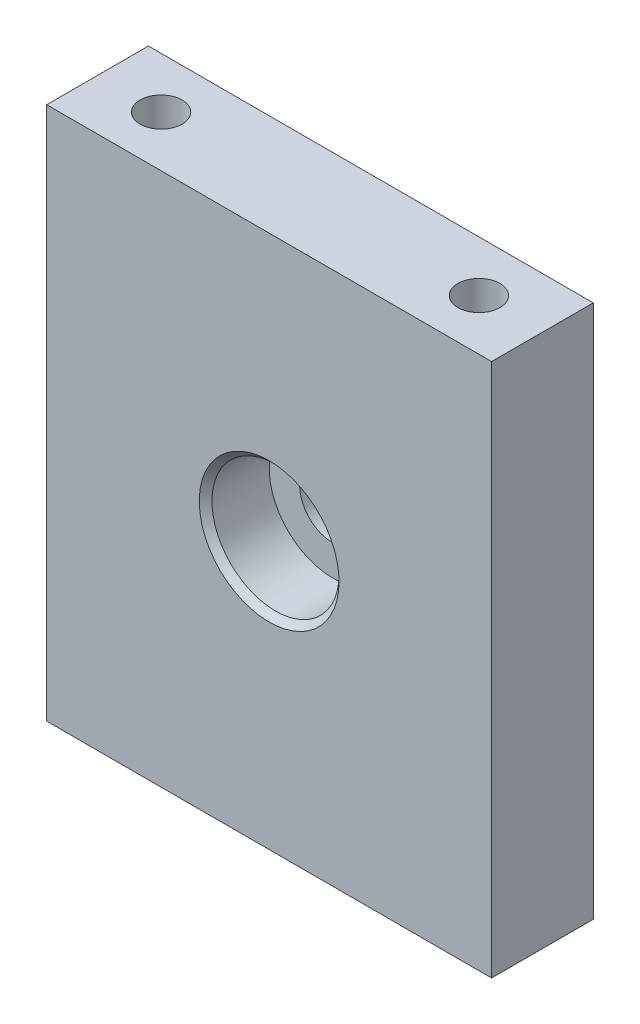
ISO-10303-21;
HEADER;
FILE_DESCRIPTION(('STEP AP214'),'2;1');
FILE_NAME('part.step','',(''),(''),'','','');
FILE_SCHEMA(('AUTOMOTIVE_DESIGN { 1 0 10303 214 1 1 1 1 }'));
ENDSEC;
DATA;
#1=APPLICATION_CONTEXT('core data for automotive mechanical design processes');
#2=APPLICATION_PROTOCOL_DEFINITION('international standard','automotive_design',2000,#1);
#3=PRODUCT_CONTEXT('',#1,'mechanical');
#4=PRODUCT('Part','Part','',(#3));
#5=PRODUCT_RELATED_PRODUCT_CATEGORY('part','',(#4));
#6=PRODUCT_DEFINITION_FORMATION('','',#4);
#7=PRODUCT_DEFINITION_CONTEXT('part definition',#1,'design');
#8=PRODUCT_DEFINITION('design','',#6,#7);
#9=PRODUCT_DEFINITION_SHAPE('','',#8);
#10=(LENGTH_UNIT() NAMED_UNIT(*) SI_UNIT(.MILLI.,.METRE.));
#11=(NAMED_UNIT(*) PLANE_ANGLE_UNIT() SI_UNIT($,.RADIAN.));
#12=(NAMED_UNIT(*) SI_UNIT($,.STERADIAN.) SOLID_ANGLE_UNIT());
#13=UNCERTAINTY_MEASURE_WITH_UNIT(LENGTH_MEASURE(1.E-05),#10,'distance_accuracy_value','');
#14=(GEOMETRIC_REPRESENTATION_CONTEXT(3) GLOBAL_UNCERTAINTY_ASSIGNED_CONTEXT((#13)) GLOBAL_UNIT_ASSIGNED_CONTEXT((#10,
#11,#12)) REPRESENTATION_CONTEXT('',''));
#15=CARTESIAN_POINT('',(0.,0.,0.));
#16=DIRECTION('',(0.,0.,1.));
#17=DIRECTION('',(1.,0.,0.));
#18=AXIS2_PLACEMENT_3D('',#15,#16,#17);
#19=CARTESIAN_POINT('',(0.,0.,-7.5));
#20=DIRECTION('',(0.,0.,1.));
#21=DIRECTION('',(1.,0.,0.));
#22=AXIS2_PLACEMENT_3D('',#19,#20,#21);
#23=CYLINDRICAL_SURFACE('',#22,2.6);
#24=CARTESIAN_POINT('',(0.,0.,-2.));
#25=DIRECTION('',(0.,0.,-1.));
#26=DIRECTION('',(-1.,0.,0.));
#27=AXIS2_PLACEMENT_3D('',#24,#25,#26);
#28=CIRCLE('',#27,2.6);
#29=CARTESIAN_POINT('',(-2.6,0.,-2.));
#30=VERTEX_POINT('',#29);
#31=EDGE_CURVE('E183',#30,#30,#28,.T.);
#32=ORIENTED_EDGE('',*,*,#31,.T.);
#33=EDGE_LOOP('',(#32));
#34=FACE_BOUND('',#33,.T.);
#35=CARTESIAN_POINT('',(0.,0.,-1.));
#36=DIRECTION('',(0.,0.,1.));
#37=DIRECTION('',(1.,0.,0.));
#38=AXIS2_PLACEMENT_3D('',#35,#36,#37);
#39=CIRCLE('',#38,2.6);
#40=CARTESIAN_POINT('',(2.6,0.,-1.));
#41=VERTEX_POINT('',#40);
#42=EDGE_CURVE('E186',#41,#41,#39,.F.);
#43=ORIENTED_EDGE('',*,*,#42,.F.);
#44=EDGE_LOOP('',(#43));
#45=FACE_BOUND('',#44,.T.);
#46=ADVANCED_FACE('F42',(#34,#45),#23,.F.);
#47=CARTESIAN_POINT('',(0.,0.,-4.));
#48=DIRECTION('',(0.,0.,1.));
#49=DIRECTION('',(1.,0.,0.));
#50=AXIS2_PLACEMENT_3D('',#47,#48,#49);
#51=PLANE('',#50);
#52=CARTESIAN_POINT('',(0.,0.,-4.));
#53=DIRECTION('',(0.,0.,1.));
#54=DIRECTION('',(1.,0.,0.));
#55=AXIS2_PLACEMENT_3D('',#52,#53,#54);
#56=CIRCLE('',#55,11.);
#57=CARTESIAN_POINT('',(11.,0.,-4.));
#58=VERTEX_POINT('',#57);
#59=EDGE_CURVE('E11',#58,#58,#56,.T.);
#60=ORIENTED_EDGE('',*,*,#59,.T.);
#61=EDGE_LOOP('',(#60));
#62=FACE_BOUND('',#61,.T.);
#63=DIRECTION('',(0.,1.,0.));
#64=VECTOR('',#63,1.);
#65=CARTESIAN_POINT('',(17.5,21.,-4.));
#66=LINE('',#65,#64);
#67=CARTESIAN_POINT('',(17.5,-21.,-4.));
#68=VERTEX_POINT('',#67);
#69=CARTESIAN_POINT('',(17.5,21.,-4.));
#70=VERTEX_POINT('',#69);
#71=EDGE_CURVE('E220',#68,#70,#66,.T.);
#72=ORIENTED_EDGE('',*,*,#71,.F.);
#73=DIRECTION('',(1.,0.,0.));
#74=VECTOR('',#73,1.);
#75=CARTESIAN_POINT('',(-17.5,-21.,-4.));
#76=LINE('',#75,#74);
#77=CARTESIAN_POINT('',(-17.5,-21.,-4.));
#78=VERTEX_POINT('',#77);
#79=EDGE_CURVE('E225',#78,#68,#76,.T.);
#80=ORIENTED_EDGE('',*,*,#79,.F.);
#81=DIRECTION('',(0.,-1.,0.));
#82=VECTOR('',#81,1.);
#83=CARTESIAN_POINT('',(-17.5,21.,-4.));
#84=LINE('',#83,#82);
#85=CARTESIAN_POINT('',(-17.5,21.,-4.));
#86=VERTEX_POINT('',#85);
#87=EDGE_CURVE('E236',#86,#78,#84,.T.);
#88=ORIENTED_EDGE('',*,*,#87,.F.);
#89=DIRECTION('',(-1.,0.,0.));
#90=VECTOR('',#89,1.);
#91=CARTESIAN_POINT('',(-17.5,21.,-4.));
#92=LINE('',#91,#90);
#93=EDGE_CURVE('E234',#70,#86,#92,.T.);
#94=ORIENTED_EDGE('',*,*,#93,.F.);
#95=EDGE_LOOP('',(#72,#80,#88,#94));
#96=FACE_BOUND('',#95,.T.);
#97=ADVANCED_FACE('F332',(#62,#96),#51,.F.);
#98=CARTESIAN_POINT('',(17.5,21.,4.));
#99=DIRECTION('',(-1.,0.,0.));
#100=DIRECTION('',(0.,-1.,0.));
#101=AXIS2_PLACEMENT_3D('',#98,#99,#100);
#102=PLANE('',#101);
#103=ORIENTED_EDGE('',*,*,#71,.T.);
#104=DIRECTION('',(0.,0.,-1.));
#105=VECTOR('',#104,1.);
#106=CARTESIAN_POINT('',(17.5,21.,4.));
#107=LINE('',#106,#105);
#108=CARTESIAN_POINT('',(17.5,21.,4.));
#109=VERTEX_POINT('',#108);
#110=EDGE_CURVE('E247',#109,#70,#107,.T.);
#111=ORIENTED_EDGE('',*,*,#110,.F.);
#112=DIRECTION('',(0.,1.,0.));
#113=VECTOR('',#112,1.);
#114=CARTESIAN_POINT('',(17.5,21.,4.));
#115=LINE('',#114,#113);
#116=CARTESIAN_POINT('',(17.5,-21.,4.));
#117=VERTEX_POINT('',#116);
#118=EDGE_CURVE('E221',#117,#109,#115,.T.);
#119=ORIENTED_EDGE('',*,*,#118,.F.);
#120=DIRECTION('',(0.,0.,-1.));
#121=VECTOR('',#120,1.);
#122=CARTESIAN_POINT('',(17.5,-21.,4.));
#123=LINE('',#122,#121);
#124=EDGE_CURVE('E231',#117,#68,#123,.T.);
#125=ORIENTED_EDGE('',*,*,#124,.T.);
#126=EDGE_LOOP('',(#103,#111,#119,#125));
#127=FACE_BOUND('',#126,.T.);
#128=ADVANCED_FACE('F338',(#127),#102,.F.);
#129=CARTESIAN_POINT('',(-17.5,21.,4.));
#130=DIRECTION('',(0.,-1.,0.));
#131=DIRECTION('',(0.,0.,-1.));
#132=AXIS2_PLACEMENT_3D('',#129,#130,#131);
#133=PLANE('',#132);
#134=CARTESIAN_POINT('',(-12.5,21.,0.));
#135=DIRECTION('',(0.,1.,0.));
#136=DIRECTION('',(0.,0.,1.));
#137=AXIS2_PLACEMENT_3D('',#134,#135,#136);
#138=CIRCLE('',#137,1.64999999999999);
#139=CARTESIAN_POINT('',(-12.5,21.,1.64999999999999));
#140=VERTEX_POINT('',#139);
#141=EDGE_CURVE('E517',#140,#140,#138,.T.);
#142=ORIENTED_EDGE('',*,*,#141,.F.);
#143=EDGE_LOOP('',(#142));
#144=FACE_BOUND('',#143,.T.);
#145=CARTESIAN_POINT('',(12.5,21.,0.));
#146=DIRECTION('',(0.,1.,0.));
#147=DIRECTION('',(0.,0.,1.));
#148=AXIS2_PLACEMENT_3D('',#145,#146,#147);
#149=CIRCLE('',#148,1.64999999999999);
#150=CARTESIAN_POINT('',(12.5,21.,1.64999999999998));
#151=VERTEX_POINT('',#150);
#152=EDGE_CURVE('E519',#151,#151,#149,.T.);
#153=ORIENTED_EDGE('',*,*,#152,.F.);
#154=EDGE_LOOP('',(#153));
#155=FACE_BOUND('',#154,.T.);
#156=ORIENTED_EDGE('',*,*,#93,.T.);
#157=DIRECTION('',(0.,0.,-1.));
#158=VECTOR('',#157,1.);
#159=CARTESIAN_POINT('',(-17.5,21.,4.));
#160=LINE('',#159,#158);
#161=CARTESIAN_POINT('',(-17.5,21.,4.));
#162=VERTEX_POINT('',#161);
#163=EDGE_CURVE('E244',#162,#86,#160,.T.);
#164=ORIENTED_EDGE('',*,*,#163,.F.);
#165=DIRECTION('',(-1.,0.,0.));
#166=VECTOR('',#165,1.);
#167=CARTESIAN_POINT('',(-17.5,21.,4.));
#168=LINE('',#167,#166);
#169=EDGE_CURVE('E224',#109,#162,#168,.T.);
#170=ORIENTED_EDGE('',*,*,#169,.F.);
#171=ORIENTED_EDGE('',*,*,#110,.T.);
#172=EDGE_LOOP('',(#156,#164,#170,#171));
#173=FACE_BOUND('',#172,.T.);
#174=ADVANCED_FACE('F393',(#144,#155,#173),#133,.F.);
#175=CARTESIAN_POINT('',(-17.5,21.,4.));
#176=DIRECTION('',(1.,0.,0.));
#177=DIRECTION('',(0.,1.,0.));
#178=AXIS2_PLACEMENT_3D('',#175,#176,#177);
#179=PLANE('',#178);
#180=ORIENTED_EDGE('',*,*,#87,.T.);
#181=DIRECTION('',(0.,0.,-1.));
#182=VECTOR('',#181,1.);
#183=CARTESIAN_POINT('',(-17.5,-21.,4.));
#184=LINE('',#183,#182);
#185=CARTESIAN_POINT('',(-17.5,-21.,4.));
#186=VERTEX_POINT('',#185);
#187=EDGE_CURVE('E241',#186,#78,#184,.T.);
#188=ORIENTED_EDGE('',*,*,#187,.F.);
#189=DIRECTION('',(0.,-1.,0.));
#190=VECTOR('',#189,1.);
#191=CARTESIAN_POINT('',(-17.5,21.,4.));
#192=LINE('',#191,#190);
#193=EDGE_CURVE('E227',#162,#186,#192,.T.);
#194=ORIENTED_EDGE('',*,*,#193,.F.);
#195=ORIENTED_EDGE('',*,*,#163,.T.);
#196=EDGE_LOOP('',(#180,#188,#194,#195));
#197=FACE_BOUND('',#196,.T.);
#198=ADVANCED_FACE('F389',(#197),#179,.F.);
#199=CARTESIAN_POINT('',(-17.5,-21.,4.));
#200=DIRECTION('',(0.,1.,0.));
#201=DIRECTION('',(0.,0.,1.));
#202=AXIS2_PLACEMENT_3D('',#199,#200,#201);
#203=PLANE('',#202);
#204=CARTESIAN_POINT('',(-12.5,-21.,0.));
#205=DIRECTION('',(0.,1.,0.));
#206=DIRECTION('',(0.,0.,1.));
#207=AXIS2_PLACEMENT_3D('',#204,#205,#206);
#208=CIRCLE('',#207,1.64999999999999);
#209=CARTESIAN_POINT('',(-12.5,-21.,1.64999999999999));
#210=VERTEX_POINT('',#209);
#211=EDGE_CURVE('E514',#210,#210,#208,.T.);
#212=ORIENTED_EDGE('',*,*,#211,.T.);
#213=EDGE_LOOP('',(#212));
#214=FACE_BOUND('',#213,.T.);
#215=CARTESIAN_POINT('',(12.5,-21.,0.));
#216=DIRECTION('',(0.,1.,0.));
#217=DIRECTION('',(0.,0.,1.));
#218=AXIS2_PLACEMENT_3D('',#215,#216,#217);
#219=CIRCLE('',#218,1.64999999999999);
#220=CARTESIAN_POINT('',(12.5,-21.,1.64999999999999));
#221=VERTEX_POINT('',#220);
#222=EDGE_CURVE('E287',#221,#221,#219,.T.);
#223=ORIENTED_EDGE('',*,*,#222,.T.);
#224=EDGE_LOOP('',(#223));
#225=FACE_BOUND('',#224,.T.);
#226=ORIENTED_EDGE('',*,*,#79,.T.);
#227=ORIENTED_EDGE('',*,*,#124,.F.);
#228=DIRECTION('',(1.,0.,0.));
#229=VECTOR('',#228,1.);
#230=CARTESIAN_POINT('',(-17.5,-21.,4.));
#231=LINE('',#230,#229);
#232=EDGE_CURVE('E229',#186,#117,#231,.T.);
#233=ORIENTED_EDGE('',*,*,#232,.F.);
#234=ORIENTED_EDGE('',*,*,#187,.T.);
#235=EDGE_LOOP('',(#226,#227,#233,#234));
#236=FACE_BOUND('',#235,.T.);
#237=ADVANCED_FACE('F384',(#214,#225,#236),#203,.F.);
#238=CARTESIAN_POINT('',(0.,0.,4.));
#239=DIRECTION('',(0.,0.,1.));
#240=DIRECTION('',(1.,0.,0.));
#241=AXIS2_PLACEMENT_3D('',#238,#239,#240);
#242=PLANE('',#241);
#243=CARTESIAN_POINT('',(0.,0.,4.));
#244=DIRECTION('',(0.,0.,1.));
#245=DIRECTION('',(1.,0.,0.));
#246=AXIS2_PLACEMENT_3D('',#243,#244,#245);
#247=CIRCLE('',#246,5.50000000000001);
#248=CARTESIAN_POINT('',(5.50000000000001,0.,4.));
#249=VERTEX_POINT('',#248);
#250=EDGE_CURVE('E309',#249,#249,#247,.F.);
#251=ORIENTED_EDGE('',*,*,#250,.T.);
#252=EDGE_LOOP('',(#251));
#253=FACE_BOUND('',#252,.T.);
#254=ORIENTED_EDGE('',*,*,#118,.T.);
#255=ORIENTED_EDGE('',*,*,#169,.T.);
#256=ORIENTED_EDGE('',*,*,#193,.T.);
#257=ORIENTED_EDGE('',*,*,#232,.T.);
#258=EDGE_LOOP('',(#254,#255,#256,#257));
#259=FACE_BOUND('',#258,.T.);
#260=ADVANCED_FACE('F379',(#253,#259),#242,.T.);
#261=CARTESIAN_POINT('',(0.,0.,-7.5));
#262=DIRECTION('',(0.,0.,-1.));
#263=DIRECTION('',(-1.,0.,0.));
#264=AXIS2_PLACEMENT_3D('',#261,#262,#263);
#265=PLANE('',#264);
#266=CARTESIAN_POINT('',(5.,5.,-7.5));
#267=DIRECTION('',(0.,0.,-1.));
#268=DIRECTION('',(-1.,0.,0.));
#269=AXIS2_PLACEMENT_3D('',#266,#267,#268);
#270=CIRCLE('',#269,1.5);
#271=CARTESIAN_POINT('',(6.5,4.99999999999999,-7.5));
#272=VERTEX_POINT('',#271);
#273=CARTESIAN_POINT('',(4.99999999999999,6.5,-7.5));
#274=VERTEX_POINT('',#273);
#275=EDGE_CURVE('E267',#272,#274,#270,.F.);
#276=ORIENTED_EDGE('',*,*,#275,.T.);
#277=DIRECTION('',(-1.,0.,0.));
#278=VECTOR('',#277,1.);
#279=CARTESIAN_POINT('',(0.,6.5,-7.5));
#280=LINE('',#279,#278);
#281=CARTESIAN_POINT('',(-4.99999999999999,6.5,-7.5));
#282=VERTEX_POINT('',#281);
#283=EDGE_CURVE('E269',#274,#282,#280,.T.);
#284=ORIENTED_EDGE('',*,*,#283,.T.);
#285=CARTESIAN_POINT('',(-5.,5.,-7.5));
#286=DIRECTION('',(0.,0.,-1.));
#287=DIRECTION('',(-1.,0.,0.));
#288=AXIS2_PLACEMENT_3D('',#285,#286,#287);
#289=CIRCLE('',#288,1.5);
#290=CARTESIAN_POINT('',(-6.5,4.99999999999999,-7.5));
#291=VERTEX_POINT('',#290);
#292=EDGE_CURVE('E265',#282,#291,#289,.F.);
#293=ORIENTED_EDGE('',*,*,#292,.T.);
#294=DIRECTION('',(0.,-1.,0.));
#295=VECTOR('',#294,1.);
#296=CARTESIAN_POINT('',(-6.5,0.,-7.5));
#297=LINE('',#296,#295);
#298=CARTESIAN_POINT('',(-6.5,-5.,-7.5));
#299=VERTEX_POINT('',#298);
#300=EDGE_CURVE('E261',#291,#299,#297,.T.);
#301=ORIENTED_EDGE('',*,*,#300,.T.);
#302=CARTESIAN_POINT('',(-5.,-5.,-7.5));
#303=DIRECTION('',(0.,0.,-1.));
#304=DIRECTION('',(-1.,0.,0.));
#305=AXIS2_PLACEMENT_3D('',#302,#303,#304);
#306=CIRCLE('',#305,1.5);
#307=CARTESIAN_POINT('',(-4.99999999999999,-6.5,-7.5));
#308=VERTEX_POINT('',#307);
#309=EDGE_CURVE('E257',#299,#308,#306,.F.);
#310=ORIENTED_EDGE('',*,*,#309,.T.);
#311=DIRECTION('',(1.,0.,0.));
#312=VECTOR('',#311,1.);
#313=CARTESIAN_POINT('',(0.,-6.5,-7.5));
#314=LINE('',#313,#312);
#315=CARTESIAN_POINT('',(4.99999999999999,-6.5,-7.5));
#316=VERTEX_POINT('',#315);
#317=EDGE_CURVE('E255',#308,#316,#314,.T.);
#318=ORIENTED_EDGE('',*,*,#317,.T.);
#319=CARTESIAN_POINT('',(5.,-5.,-7.5));
#320=DIRECTION('',(0.,0.,-1.));
#321=DIRECTION('',(-1.,0.,0.));
#322=AXIS2_PLACEMENT_3D('',#319,#320,#321);
#323=CIRCLE('',#322,1.5);
#324=CARTESIAN_POINT('',(6.5,-4.99999999999999,-7.5));
#325=VERTEX_POINT('',#324);
#326=EDGE_CURVE('E259',#316,#325,#323,.F.);
#327=ORIENTED_EDGE('',*,*,#326,.T.);
#328=DIRECTION('',(0.,1.,0.));
#329=VECTOR('',#328,1.);
#330=CARTESIAN_POINT('',(6.5,0.,-7.5));
#331=LINE('',#330,#329);
#332=EDGE_CURVE('E263',#325,#272,#331,.T.);
#333=ORIENTED_EDGE('',*,*,#332,.T.);
#334=EDGE_LOOP('',(#276,#284,#293,#301,#310,#318,#327,#333));
#335=FACE_BOUND('',#334,.T.);
#336=CARTESIAN_POINT('',(0.,0.,-7.5));
#337=DIRECTION('',(0.,0.,-1.));
#338=DIRECTION('',(-1.,0.,0.));
#339=AXIS2_PLACEMENT_3D('',#336,#337,#338);
#340=CIRCLE('',#339,10.);
#341=CARTESIAN_POINT('',(-10.,0.,-7.5));
#342=VERTEX_POINT('',#341);
#343=EDGE_CURVE('E217',#342,#342,#340,.T.);
#344=ORIENTED_EDGE('',*,*,#343,.T.);
#345=EDGE_LOOP('',(#344));
#346=FACE_BOUND('',#345,.T.);
#347=ADVANCED_FACE('F376',(#335,#346),#265,.T.);
#348=CARTESIAN_POINT('',(0.,0.,-7.5));
#349=DIRECTION('',(0.,0.,1.));
#350=DIRECTION('',(1.,0.,0.));
#351=AXIS2_PLACEMENT_3D('',#348,#349,#350);
#352=CYLINDRICAL_SURFACE('',#351,10.);
#353=CARTESIAN_POINT('',(0.,0.,-5.));
#354=DIRECTION('',(0.,0.,1.));
#355=DIRECTION('',(1.,0.,0.));
#356=AXIS2_PLACEMENT_3D('',#353,#354,#355);
#357=CIRCLE('',#356,10.);
#358=CARTESIAN_POINT('',(10.,0.,-5.));
#359=VERTEX_POINT('',#358);
#360=EDGE_CURVE('E51',#359,#359,#357,.F.);
#361=ORIENTED_EDGE('',*,*,#360,.T.);
#362=EDGE_LOOP('',(#361));
#363=FACE_BOUND('',#362,.T.);
#364=ORIENTED_EDGE('',*,*,#343,.F.);
#365=EDGE_LOOP('',(#364));
#366=FACE_BOUND('',#365,.T.);
#367=ADVANCED_FACE('F314',(#363,#366),#352,.T.);
#368=CARTESIAN_POINT('',(-5.,5.,-7.5));
#369=DIRECTION('',(0.,0.,1.));
#370=DIRECTION('',(1.,0.,0.));
#371=AXIS2_PLACEMENT_3D('',#368,#369,#370);
#372=CYLINDRICAL_SURFACE('',#371,1.);
#373=DIRECTION('',(0.,0.,1.));
#374=VECTOR('',#373,1.);
#375=CARTESIAN_POINT('',(-6.,4.99999999999999,-7.5));
#376=LINE('',#375,#374);
#377=CARTESIAN_POINT('',(-6.,4.99999999999999,-7.));
#378=VERTEX_POINT('',#377);
#379=CARTESIAN_POINT('',(-6.,4.99999999999999,-2.));
#380=VERTEX_POINT('',#379);
#381=EDGE_CURVE('E168',#378,#380,#376,.T.);
#382=ORIENTED_EDGE('',*,*,#381,.F.);
#383=CARTESIAN_POINT('',(-5.,5.,-7.));
#384=DIRECTION('',(0.,0.,-1.));
#385=DIRECTION('',(-1.,0.,0.));
#386=AXIS2_PLACEMENT_3D('',#383,#384,#385);
#387=CIRCLE('',#386,1.);
#388=CARTESIAN_POINT('',(-4.99999999999999,6.,-7.));
#389=VERTEX_POINT('',#388);
#390=EDGE_CURVE('E274',#378,#389,#387,.T.);
#391=ORIENTED_EDGE('',*,*,#390,.T.);
#392=DIRECTION('',(0.,0.,1.));
#393=VECTOR('',#392,1.);
#394=CARTESIAN_POINT('',(-4.99999999999999,6.,-7.5));
#395=LINE('',#394,#393);
#396=CARTESIAN_POINT('',(-4.99999999999999,6.,-2.));
#397=VERTEX_POINT('',#396);
#398=EDGE_CURVE('E215',#389,#397,#395,.T.);
#399=ORIENTED_EDGE('',*,*,#398,.T.);
#400=CARTESIAN_POINT('',(-5.,5.,-2.));
#401=DIRECTION('',(0.,0.,-1.));
#402=DIRECTION('',(-1.,0.,0.));
#403=AXIS2_PLACEMENT_3D('',#400,#401,#402);
#404=CIRCLE('',#403,1.);
#405=EDGE_CURVE('E177',#380,#397,#404,.T.);
#406=ORIENTED_EDGE('',*,*,#405,.F.);
#407=EDGE_LOOP('',(#382,#391,#399,#406));
#408=FACE_BOUND('',#407,.T.);
#409=ADVANCED_FACE('F371',(#408),#372,.F.);
#410=CARTESIAN_POINT('',(4.99999999999999,6.,-7.5));
#411=DIRECTION('',(0.,-1.,0.));
#412=DIRECTION('',(0.,0.,-1.));
#413=AXIS2_PLACEMENT_3D('',#410,#411,#412);
#414=PLANE('',#413);
#415=ORIENTED_EDGE('',*,*,#398,.F.);
#416=DIRECTION('',(1.,0.,0.));
#417=VECTOR('',#416,1.);
#418=CARTESIAN_POINT('',(4.99999999999999,6.,-7.));
#419=LINE('',#418,#417);
#420=CARTESIAN_POINT('',(4.99999999999999,6.,-7.));
#421=VERTEX_POINT('',#420);
#422=EDGE_CURVE('E249',#389,#421,#419,.T.);
#423=ORIENTED_EDGE('',*,*,#422,.T.);
#424=DIRECTION('',(0.,0.,1.));
#425=VECTOR('',#424,1.);
#426=CARTESIAN_POINT('',(4.99999999999999,6.,-7.5));
#427=LINE('',#426,#425);
#428=CARTESIAN_POINT('',(4.99999999999999,6.,-2.));
#429=VERTEX_POINT('',#428);
#430=EDGE_CURVE('E213',#421,#429,#427,.T.);
#431=ORIENTED_EDGE('',*,*,#430,.T.);
#432=DIRECTION('',(1.,0.,0.));
#433=VECTOR('',#432,1.);
#434=CARTESIAN_POINT('',(-4.99999999999999,6.,-2.));
#435=LINE('',#434,#433);
#436=EDGE_CURVE('E193',#397,#429,#435,.T.);
#437=ORIENTED_EDGE('',*,*,#436,.F.);
#438=EDGE_LOOP('',(#415,#423,#431,#437));
#439=FACE_BOUND('',#438,.T.);
#440=ADVANCED_FACE('F367',(#439),#414,.T.);
#441=CARTESIAN_POINT('',(5.,5.,-7.5));
#442=DIRECTION('',(0.,0.,1.));
#443=DIRECTION('',(1.,0.,0.));
#444=AXIS2_PLACEMENT_3D('',#441,#442,#443);
#445=CYLINDRICAL_SURFACE('',#444,1.);
#446=ORIENTED_EDGE('',*,*,#430,.F.);
#447=CARTESIAN_POINT('',(5.,5.,-7.));
#448=DIRECTION('',(0.,0.,-1.));
#449=DIRECTION('',(-1.,0.,0.));
#450=AXIS2_PLACEMENT_3D('',#447,#448,#449);
#451=CIRCLE('',#450,1.);
#452=CARTESIAN_POINT('',(6.,4.99999999999999,-7.));
#453=VERTEX_POINT('',#452);
#454=EDGE_CURVE('E272',#421,#453,#451,.T.);
#455=ORIENTED_EDGE('',*,*,#454,.T.);
#456=DIRECTION('',(0.,0.,1.));
#457=VECTOR('',#456,1.);
#458=CARTESIAN_POINT('',(6.,4.99999999999999,-7.5));
#459=LINE('',#458,#457);
#460=CARTESIAN_POINT('',(6.,4.99999999999999,-2.));
#461=VERTEX_POINT('',#460);
#462=EDGE_CURVE('E211',#453,#461,#459,.T.);
#463=ORIENTED_EDGE('',*,*,#462,.T.);
#464=CARTESIAN_POINT('',(5.,5.,-2.));
#465=DIRECTION('',(0.,0.,-1.));
#466=DIRECTION('',(-1.,0.,0.));
#467=AXIS2_PLACEMENT_3D('',#464,#465,#466);
#468=CIRCLE('',#467,1.);
#469=EDGE_CURVE('E196',#429,#461,#468,.T.);
#470=ORIENTED_EDGE('',*,*,#469,.F.);
#471=EDGE_LOOP('',(#446,#455,#463,#470));
#472=FACE_BOUND('',#471,.T.);
#473=ADVANCED_FACE('F363',(#472),#445,.F.);
#474=CARTESIAN_POINT('',(6.,4.99999999999999,-7.5));
#475=DIRECTION('',(-1.,0.,0.));
#476=DIRECTION('',(0.,-1.,0.));
#477=AXIS2_PLACEMENT_3D('',#474,#475,#476);
#478=PLANE('',#477);
#479=ORIENTED_EDGE('',*,*,#462,.F.);
#480=DIRECTION('',(0.,-1.,0.));
#481=VECTOR('',#480,1.);
#482=CARTESIAN_POINT('',(6.,4.99999999999999,-7.));
#483=LINE('',#482,#481);
#484=CARTESIAN_POINT('',(6.,-4.99999999999999,-7.));
#485=VERTEX_POINT('',#484);
#486=EDGE_CURVE('E276',#453,#485,#483,.T.);
#487=ORIENTED_EDGE('',*,*,#486,.T.);
#488=DIRECTION('',(0.,0.,1.));
#489=VECTOR('',#488,1.);
#490=CARTESIAN_POINT('',(6.,-4.99999999999999,-7.5));
#491=LINE('',#490,#489);
#492=CARTESIAN_POINT('',(6.,-4.99999999999999,-2.));
#493=VERTEX_POINT('',#492);
#494=EDGE_CURVE('E209',#485,#493,#491,.T.);
#495=ORIENTED_EDGE('',*,*,#494,.T.);
#496=DIRECTION('',(0.,-1.,0.));
#497=VECTOR('',#496,1.);
#498=CARTESIAN_POINT('',(6.,4.99999999999999,-2.));
#499=LINE('',#498,#497);
#500=EDGE_CURVE('E199',#461,#493,#499,.T.);
#501=ORIENTED_EDGE('',*,*,#500,.F.);
#502=EDGE_LOOP('',(#479,#487,#495,#501));
#503=FACE_BOUND('',#502,.T.);
#504=ADVANCED_FACE('F360',(#503),#478,.T.);
#505=CARTESIAN_POINT('',(5.,-5.,-7.5));
#506=DIRECTION('',(0.,0.,1.));
#507=DIRECTION('',(1.,0.,0.));
#508=AXIS2_PLACEMENT_3D('',#505,#506,#507);
#509=CYLINDRICAL_SURFACE('',#508,1.);
#510=ORIENTED_EDGE('',*,*,#494,.F.);
#511=CARTESIAN_POINT('',(5.,-5.,-7.));
#512=DIRECTION('',(0.,0.,-1.));
#513=DIRECTION('',(-1.,0.,0.));
#514=AXIS2_PLACEMENT_3D('',#511,#512,#513);
#515=CIRCLE('',#514,1.);
#516=CARTESIAN_POINT('',(4.99999999999999,-6.,-7.));
#517=VERTEX_POINT('',#516);
#518=EDGE_CURVE('E66',#485,#517,#515,.T.);
#519=ORIENTED_EDGE('',*,*,#518,.T.);
#520=DIRECTION('',(0.,0.,1.));
#521=VECTOR('',#520,1.);
#522=CARTESIAN_POINT('',(4.99999999999999,-6.,-7.5));
#523=LINE('',#522,#521);
#524=CARTESIAN_POINT('',(4.99999999999999,-6.,-2.));
#525=VERTEX_POINT('',#524);
#526=EDGE_CURVE('E207',#517,#525,#523,.T.);
#527=ORIENTED_EDGE('',*,*,#526,.T.);
#528=CARTESIAN_POINT('',(5.,-5.,-2.));
#529=DIRECTION('',(0.,0.,-1.));
#530=DIRECTION('',(-1.,0.,0.));
#531=AXIS2_PLACEMENT_3D('',#528,#529,#530);
#532=CIRCLE('',#531,1.);
#533=EDGE_CURVE('E202',#493,#525,#532,.T.);
#534=ORIENTED_EDGE('',*,*,#533,.F.);
#535=EDGE_LOOP('',(#510,#519,#527,#534));
#536=FACE_BOUND('',#535,.T.);
#537=ADVANCED_FACE('F357',(#536),#509,.F.);
#538=CARTESIAN_POINT('',(4.99999999999999,-6.,-7.5));
#539=DIRECTION('',(0.,1.,0.));
#540=DIRECTION('',(0.,0.,1.));
#541=AXIS2_PLACEMENT_3D('',#538,#539,#540);
#542=PLANE('',#541);
#543=ORIENTED_EDGE('',*,*,#526,.F.);
#544=DIRECTION('',(-1.,0.,0.));
#545=VECTOR('',#544,1.);
#546=CARTESIAN_POINT('',(4.99999999999999,-6.,-7.));
#547=LINE('',#546,#545);
#548=CARTESIAN_POINT('',(-4.99999999999999,-6.,-7.));
#549=VERTEX_POINT('',#548);
#550=EDGE_CURVE('E58',#517,#549,#547,.T.);
#551=ORIENTED_EDGE('',*,*,#550,.T.);
#552=DIRECTION('',(0.,0.,1.));
#553=VECTOR('',#552,1.);
#554=CARTESIAN_POINT('',(-4.99999999999999,-6.,-7.5));
#555=LINE('',#554,#553);
#556=CARTESIAN_POINT('',(-4.99999999999999,-6.,-2.));
#557=VERTEX_POINT('',#556);
#558=EDGE_CURVE('E167',#549,#557,#555,.T.);
#559=ORIENTED_EDGE('',*,*,#558,.T.);
#560=DIRECTION('',(-1.,0.,0.));
#561=VECTOR('',#560,1.);
#562=CARTESIAN_POINT('',(4.99999999999999,-6.,-2.));
#563=LINE('',#562,#561);
#564=EDGE_CURVE('E182',#525,#557,#563,.T.);
#565=ORIENTED_EDGE('',*,*,#564,.F.);
#566=EDGE_LOOP('',(#543,#551,#559,#565));
#567=FACE_BOUND('',#566,.T.);
#568=ADVANCED_FACE('F354',(#567),#542,.T.);
#569=CARTESIAN_POINT('',(-5.,-5.,-7.5));
#570=DIRECTION('',(0.,0.,1.));
#571=DIRECTION('',(1.,0.,0.));
#572=AXIS2_PLACEMENT_3D('',#569,#570,#571);
#573=CYLINDRICAL_SURFACE('',#572,1.);
#574=ORIENTED_EDGE('',*,*,#558,.F.);
#575=CARTESIAN_POINT('',(-5.,-5.,-7.));
#576=DIRECTION('',(0.,0.,-1.));
#577=DIRECTION('',(-1.,0.,0.));
#578=AXIS2_PLACEMENT_3D('',#575,#576,#577);
#579=CIRCLE('',#578,1.);
#580=CARTESIAN_POINT('',(-6.,-5.,-7.));
#581=VERTEX_POINT('',#580);
#582=EDGE_CURVE('E164',#549,#581,#579,.T.);
#583=ORIENTED_EDGE('',*,*,#582,.T.);
#584=DIRECTION('',(0.,0.,1.));
#585=VECTOR('',#584,1.);
#586=CARTESIAN_POINT('',(-6.,-5.,-7.5));
#587=LINE('',#586,#585);
#588=CARTESIAN_POINT('',(-6.,-5.,-2.));
#589=VERTEX_POINT('',#588);
#590=EDGE_CURVE('E157',#581,#589,#587,.T.);
#591=ORIENTED_EDGE('',*,*,#590,.T.);
#592=CARTESIAN_POINT('',(-5.,-5.,-2.));
#593=DIRECTION('',(0.,0.,-1.));
#594=DIRECTION('',(-1.,0.,0.));
#595=AXIS2_PLACEMENT_3D('',#592,#593,#594);
#596=CIRCLE('',#595,1.);
#597=EDGE_CURVE('E161',#557,#589,#596,.T.);
#598=ORIENTED_EDGE('',*,*,#597,.F.);
#599=EDGE_LOOP('',(#574,#583,#591,#598));
#600=FACE_BOUND('',#599,.T.);
#601=ADVANCED_FACE('F159',(#600),#573,.F.);
#602=CARTESIAN_POINT('',(-6.,4.99999999999999,-7.5));
#603=DIRECTION('',(1.,0.,0.));
#604=DIRECTION('',(0.,1.,0.));
#605=AXIS2_PLACEMENT_3D('',#602,#603,#604);
#606=PLANE('',#605);
#607=ORIENTED_EDGE('',*,*,#590,.F.);
#608=DIRECTION('',(0.,1.,0.));
#609=VECTOR('',#608,1.);
#610=CARTESIAN_POINT('',(-6.,4.99999999999999,-7.));
#611=LINE('',#610,#609);
#612=EDGE_CURVE('E278',#581,#378,#611,.T.);
#613=ORIENTED_EDGE('',*,*,#612,.T.);
#614=ORIENTED_EDGE('',*,*,#381,.T.);
#615=DIRECTION('',(0.,1.,0.));
#616=VECTOR('',#615,1.);
#617=CARTESIAN_POINT('',(-6.,-5.,-2.));
#618=LINE('',#617,#616);
#619=EDGE_CURVE('E171',#589,#380,#618,.T.);
#620=ORIENTED_EDGE('',*,*,#619,.F.);
#621=EDGE_LOOP('',(#607,#613,#614,#620));
#622=FACE_BOUND('',#621,.T.);
#623=ADVANCED_FACE('F172',(#622),#606,.T.);
#624=CARTESIAN_POINT('',(-5.,-5.,-2.));
#625=DIRECTION('',(0.,0.,-1.));
#626=DIRECTION('',(-1.,0.,0.));
#627=AXIS2_PLACEMENT_3D('',#624,#625,#626);
#628=PLANE('',#627);
#629=ORIENTED_EDGE('',*,*,#31,.F.);
#630=EDGE_LOOP('',(#629));
#631=FACE_BOUND('',#630,.T.);
#632=ORIENTED_EDGE('',*,*,#597,.T.);
#633=ORIENTED_EDGE('',*,*,#619,.T.);
#634=ORIENTED_EDGE('',*,*,#405,.T.);
#635=ORIENTED_EDGE('',*,*,#436,.T.);
#636=ORIENTED_EDGE('',*,*,#469,.T.);
#637=ORIENTED_EDGE('',*,*,#500,.T.);
#638=ORIENTED_EDGE('',*,*,#533,.T.);
#639=ORIENTED_EDGE('',*,*,#564,.T.);
#640=EDGE_LOOP('',(#632,#633,#634,#635,#636,#637,#638,#639));
#641=FACE_BOUND('',#640,.T.);
#642=ADVANCED_FACE('F179',(#631,#641),#628,.T.);
#643=CARTESIAN_POINT('',(0.,0.,-1.));
#644=DIRECTION('',(0.,0.,1.));
#645=DIRECTION('',(1.,0.,0.));
#646=AXIS2_PLACEMENT_3D('',#643,#644,#645);
#647=PLANE('',#646);
#648=CARTESIAN_POINT('',(0.,0.,-1.));
#649=DIRECTION('',(0.,0.,1.));
#650=DIRECTION('',(1.,0.,0.));
#651=AXIS2_PLACEMENT_3D('',#648,#649,#650);
#652=CIRCLE('',#651,5.);
#653=CARTESIAN_POINT('',(5.,0.,-1.));
#654=VERTEX_POINT('',#653);
#655=EDGE_CURVE('E189',#654,#654,#652,.T.);
#656=ORIENTED_EDGE('',*,*,#655,.T.);
#657=EDGE_LOOP('',(#656));
#658=FACE_BOUND('',#657,.T.);
#659=ORIENTED_EDGE('',*,*,#42,.T.);
#660=EDGE_LOOP('',(#659));
#661=FACE_BOUND('',#660,.T.);
#662=ADVANCED_FACE('F348',(#658,#661),#647,.T.);
#663=CARTESIAN_POINT('',(0.,0.,-1.));
#664=DIRECTION('',(0.,0.,1.));
#665=DIRECTION('',(1.,0.,0.));
#666=AXIS2_PLACEMENT_3D('',#663,#664,#665);
#667=CYLINDRICAL_SURFACE('',#666,5.);
#668=CARTESIAN_POINT('',(0.,0.,3.49999999999999));
#669=DIRECTION('',(0.,0.,1.));
#670=DIRECTION('',(1.,0.,0.));
#671=AXIS2_PLACEMENT_3D('',#668,#669,#670);
#672=CIRCLE('',#671,5.);
#673=CARTESIAN_POINT('',(5.,0.,3.49999999999999));
#674=VERTEX_POINT('',#673);
#675=EDGE_CURVE('E283',#674,#674,#672,.T.);
#676=ORIENTED_EDGE('',*,*,#675,.T.);
#677=EDGE_LOOP('',(#676));
#678=FACE_BOUND('',#677,.T.);
#679=ORIENTED_EDGE('',*,*,#655,.F.);
#680=EDGE_LOOP('',(#679));
#681=FACE_BOUND('',#680,.T.);
#682=ADVANCED_FACE('F344',(#678,#681),#667,.F.);
#683=CARTESIAN_POINT('',(4.99999999999999,-6.,-7.));
#684=DIRECTION('',(0.,-0.707106781186547,0.707106781186547));
#685=DIRECTION('',(-1.,0.,0.));
#686=AXIS2_PLACEMENT_3D('',#683,#684,#685);
#687=PLANE('',#686);
#688=DIRECTION('',(0.,0.707106781186547,0.707106781186547));
#689=VECTOR('',#688,1.);
#690=CARTESIAN_POINT('',(4.99999999999999,-6.5,-7.5));
#691=LINE('',#690,#689);
#692=EDGE_CURVE('E301',#316,#517,#691,.T.);
#693=ORIENTED_EDGE('',*,*,#692,.F.);
#694=ORIENTED_EDGE('',*,*,#317,.F.);
#695=DIRECTION('',(0.,-0.707106781186547,-0.707106781186547));
#696=VECTOR('',#695,1.);
#697=CARTESIAN_POINT('',(-4.99999999999999,-6.,-7.));
#698=LINE('',#697,#696);
#699=EDGE_CURVE('E304',#549,#308,#698,.T.);
#700=ORIENTED_EDGE('',*,*,#699,.F.);
#701=ORIENTED_EDGE('',*,*,#550,.F.);
#702=EDGE_LOOP('',(#693,#694,#700,#701));
#703=FACE_BOUND('',#702,.T.);
#704=ADVANCED_FACE('F450',(#703),#687,.F.);
#705=CARTESIAN_POINT('',(-5.,-5.,-7.));
#706=DIRECTION('',(0.,0.,-1.));
#707=DIRECTION('',(-1.,0.,0.));
#708=AXIS2_PLACEMENT_3D('',#705,#706,#707);
#709=CONICAL_SURFACE('',#708,1.,0.785398163397448);
#710=ORIENTED_EDGE('',*,*,#699,.T.);
#711=ORIENTED_EDGE('',*,*,#309,.F.);
#712=DIRECTION('',(-0.707106781186547,0.,-0.707106781186547));
#713=VECTOR('',#712,1.);
#714=CARTESIAN_POINT('',(-6.,-5.,-7.));
#715=LINE('',#714,#713);
#716=EDGE_CURVE('E298',#581,#299,#715,.T.);
#717=ORIENTED_EDGE('',*,*,#716,.F.);
#718=ORIENTED_EDGE('',*,*,#582,.F.);
#719=EDGE_LOOP('',(#710,#711,#717,#718));
#720=FACE_BOUND('',#719,.T.);
#721=ADVANCED_FACE('F443',(#720),#709,.F.);
#722=CARTESIAN_POINT('',(5.,-5.,-7.));
#723=DIRECTION('',(0.,0.,-1.));
#724=DIRECTION('',(-1.,0.,0.));
#725=AXIS2_PLACEMENT_3D('',#722,#723,#724);
#726=CONICAL_SURFACE('',#725,1.,0.785398163397448);
#727=ORIENTED_EDGE('',*,*,#692,.T.);
#728=ORIENTED_EDGE('',*,*,#518,.F.);
#729=DIRECTION('',(-0.707106781186547,0.,0.707106781186547));
#730=VECTOR('',#729,1.);
#731=CARTESIAN_POINT('',(6.5,-4.99999999999999,-7.5));
#732=LINE('',#731,#730);
#733=EDGE_CURVE('E295',#325,#485,#732,.T.);
#734=ORIENTED_EDGE('',*,*,#733,.F.);
#735=ORIENTED_EDGE('',*,*,#326,.F.);
#736=EDGE_LOOP('',(#727,#728,#734,#735));
#737=FACE_BOUND('',#736,.T.);
#738=ADVANCED_FACE('F436',(#737),#726,.F.);
#739=CARTESIAN_POINT('',(-6.,4.99999999999999,-7.));
#740=DIRECTION('',(-0.707106781186547,0.,0.707106781186547));
#741=DIRECTION('',(0.,1.,0.));
#742=AXIS2_PLACEMENT_3D('',#739,#740,#741);
#743=PLANE('',#742);
#744=ORIENTED_EDGE('',*,*,#716,.T.);
#745=ORIENTED_EDGE('',*,*,#300,.F.);
#746=DIRECTION('',(-0.707106781186547,0.,-0.707106781186547));
#747=VECTOR('',#746,1.);
#748=CARTESIAN_POINT('',(-6.,4.99999999999999,-7.));
#749=LINE('',#748,#747);
#750=EDGE_CURVE('E292',#378,#291,#749,.T.);
#751=ORIENTED_EDGE('',*,*,#750,.F.);
#752=ORIENTED_EDGE('',*,*,#612,.F.);
#753=EDGE_LOOP('',(#744,#745,#751,#752));
#754=FACE_BOUND('',#753,.T.);
#755=ADVANCED_FACE('F429',(#754),#743,.F.);
#756=CARTESIAN_POINT('',(6.,4.99999999999999,-7.));
#757=DIRECTION('',(0.707106781186547,0.,0.707106781186547));
#758=DIRECTION('',(0.,-1.,0.));
#759=AXIS2_PLACEMENT_3D('',#756,#757,#758);
#760=PLANE('',#759);
#761=ORIENTED_EDGE('',*,*,#733,.T.);
#762=ORIENTED_EDGE('',*,*,#486,.F.);
#763=DIRECTION('',(-0.707106781186547,0.,0.707106781186547));
#764=VECTOR('',#763,1.);
#765=CARTESIAN_POINT('',(6.5,4.99999999999999,-7.5));
#766=LINE('',#765,#764);
#767=EDGE_CURVE('E289',#272,#453,#766,.T.);
#768=ORIENTED_EDGE('',*,*,#767,.F.);
#769=ORIENTED_EDGE('',*,*,#332,.F.);
#770=EDGE_LOOP('',(#761,#762,#768,#769));
#771=FACE_BOUND('',#770,.T.);
#772=ADVANCED_FACE('F422',(#771),#760,.F.);
#773=CARTESIAN_POINT('',(-5.,5.,-7.));
#774=DIRECTION('',(0.,0.,-1.));
#775=DIRECTION('',(-1.,0.,0.));
#776=AXIS2_PLACEMENT_3D('',#773,#774,#775);
#777=CONICAL_SURFACE('',#776,1.,0.785398163397448);
#778=ORIENTED_EDGE('',*,*,#750,.T.);
#779=ORIENTED_EDGE('',*,*,#292,.F.);
#780=DIRECTION('',(0.,0.707106781186547,-0.707106781186547));
#781=VECTOR('',#780,1.);
#782=CARTESIAN_POINT('',(-4.99999999999999,6.,-7.));
#783=LINE('',#782,#781);
#784=EDGE_CURVE('E286',#389,#282,#783,.T.);
#785=ORIENTED_EDGE('',*,*,#784,.F.);
#786=ORIENTED_EDGE('',*,*,#390,.F.);
#787=EDGE_LOOP('',(#778,#779,#785,#786));
#788=FACE_BOUND('',#787,.T.);
#789=ADVANCED_FACE('F415',(#788),#777,.F.);
#790=CARTESIAN_POINT('',(5.,5.,-7.));
#791=DIRECTION('',(0.,0.,-1.));
#792=DIRECTION('',(-1.,0.,0.));
#793=AXIS2_PLACEMENT_3D('',#790,#791,#792);
#794=CONICAL_SURFACE('',#793,1.,0.785398163397448);
#795=ORIENTED_EDGE('',*,*,#767,.T.);
#796=ORIENTED_EDGE('',*,*,#454,.F.);
#797=DIRECTION('',(0.,-0.707106781186547,0.707106781186547));
#798=VECTOR('',#797,1.);
#799=CARTESIAN_POINT('',(4.99999999999999,6.5,-7.5));
#800=LINE('',#799,#798);
#801=EDGE_CURVE('E284',#274,#421,#800,.T.);
#802=ORIENTED_EDGE('',*,*,#801,.F.);
#803=ORIENTED_EDGE('',*,*,#275,.F.);
#804=EDGE_LOOP('',(#795,#796,#802,#803));
#805=FACE_BOUND('',#804,.T.);
#806=ADVANCED_FACE('F408',(#805),#794,.F.);
#807=CARTESIAN_POINT('',(4.99999999999999,6.,-7.));
#808=DIRECTION('',(0.,0.707106781186547,0.707106781186547));
#809=DIRECTION('',(1.,0.,0.));
#810=AXIS2_PLACEMENT_3D('',#807,#808,#809);
#811=PLANE('',#810);
#812=ORIENTED_EDGE('',*,*,#784,.T.);
#813=ORIENTED_EDGE('',*,*,#283,.F.);
#814=ORIENTED_EDGE('',*,*,#801,.T.);
#815=ORIENTED_EDGE('',*,*,#422,.F.);
#816=EDGE_LOOP('',(#812,#813,#814,#815));
#817=FACE_BOUND('',#816,.T.);
#818=ADVANCED_FACE('F328',(#817),#811,.F.);
#819=CARTESIAN_POINT('',(0.,0.,3.49999999999999));
#820=DIRECTION('',(0.,0.,1.));
#821=DIRECTION('',(1.,0.,0.));
#822=AXIS2_PLACEMENT_3D('',#819,#820,#821);
#823=CONICAL_SURFACE('',#822,5.,0.785398163397445);
#824=ORIENTED_EDGE('',*,*,#250,.F.);
#825=EDGE_LOOP('',(#824));
#826=FACE_BOUND('',#825,.T.);
#827=ORIENTED_EDGE('',*,*,#675,.F.);
#828=EDGE_LOOP('',(#827));
#829=FACE_BOUND('',#828,.T.);
#830=ADVANCED_FACE('F319',(#826,#829),#823,.F.);
#831=CARTESIAN_POINT('',(0.,0.,-5.));
#832=DIRECTION('',(0.,0.,1.));
#833=DIRECTION('',(1.,0.,0.));
#834=AXIS2_PLACEMENT_3D('',#831,#832,#833);
#835=CONICAL_SURFACE('',#834,10.,0.785398163397445);
#836=ORIENTED_EDGE('',*,*,#59,.F.);
#837=EDGE_LOOP('',(#836));
#838=FACE_BOUND('',#837,.T.);
#839=ORIENTED_EDGE('',*,*,#360,.F.);
#840=EDGE_LOOP('',(#839));
#841=FACE_BOUND('',#840,.T.);
#842=ADVANCED_FACE('F45',(#838,#841),#835,.T.);
#843=CARTESIAN_POINT('',(12.5,21.,0.));
#844=DIRECTION('',(0.,1.,0.));
#845=DIRECTION('',(0.,0.,1.));
#846=AXIS2_PLACEMENT_3D('',#843,#844,#845);
#847=CYLINDRICAL_SURFACE('',#846,1.64999999999999);
#848=ORIENTED_EDGE('',*,*,#222,.F.);
#849=EDGE_LOOP('',(#848));
#850=FACE_BOUND('',#849,.T.);
#851=ORIENTED_EDGE('',*,*,#152,.T.);
#852=EDGE_LOOP('',(#851));
#853=FACE_BOUND('',#852,.T.);
#854=ADVANCED_FACE('F318',(#850,#853),#847,.F.);
#855=CARTESIAN_POINT('',(-12.5,21.,0.));
#856=DIRECTION('',(0.,1.,0.));
#857=DIRECTION('',(0.,0.,1.));
#858=AXIS2_PLACEMENT_3D('',#855,#856,#857);
#859=CYLINDRICAL_SURFACE('',#858,1.64999999999999);
#860=ORIENTED_EDGE('',*,*,#211,.F.);
#861=EDGE_LOOP('',(#860));
#862=FACE_BOUND('',#861,.T.);
#863=ORIENTED_EDGE('',*,*,#141,.T.);
#864=EDGE_LOOP('',(#863));
#865=FACE_BOUND('',#864,.T.);
#866=ADVANCED_FACE('F325',(#862,#865),#859,.F.);
#867=CLOSED_SHELL('',(#46,#97,#128,#174,#198,#237,#260,#347,#367,#409,#440,#473,#504,#537,#568,
#601,#623,#642,#662,#682,#704,#721,#738,#755,#772,#789,#806,#818,#830,#842,#854,#866));
#868=MANIFOLD_SOLID_BREP('B2',#867);
#869=ADVANCED_BREP_SHAPE_REPRESENTATION('',(#18,#868),#14);
#870=SHAPE_DEFINITION_REPRESENTATION(#9,#869);
ENDSEC;
END-ISO-10303-21;
